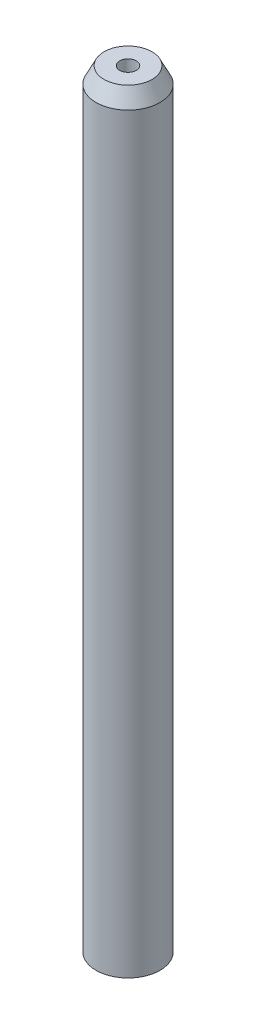
ISO-10303-21;
HEADER;
FILE_DESCRIPTION(('STEP AP214'),'2;1');
FILE_NAME('part.step','',(''),(''),'','','');
FILE_SCHEMA(('AUTOMOTIVE_DESIGN { 1 0 10303 214 1 1 1 1 }'));
ENDSEC;
DATA;
#1=APPLICATION_CONTEXT('core data for automotive mechanical design processes');
#2=APPLICATION_PROTOCOL_DEFINITION('international standard','automotive_design',2000,#1);
#3=PRODUCT_CONTEXT('',#1,'mechanical');
#4=PRODUCT('Part','Part','',(#3));
#5=PRODUCT_RELATED_PRODUCT_CATEGORY('part','',(#4));
#6=PRODUCT_DEFINITION_FORMATION('','',#4);
#7=PRODUCT_DEFINITION_CONTEXT('part definition',#1,'design');
#8=PRODUCT_DEFINITION('design','',#6,#7);
#9=PRODUCT_DEFINITION_SHAPE('','',#8);
#10=(LENGTH_UNIT() NAMED_UNIT(*) SI_UNIT(.MILLI.,.METRE.));
#11=(NAMED_UNIT(*) PLANE_ANGLE_UNIT() SI_UNIT($,.RADIAN.));
#12=(NAMED_UNIT(*) SI_UNIT($,.STERADIAN.) SOLID_ANGLE_UNIT());
#13=UNCERTAINTY_MEASURE_WITH_UNIT(LENGTH_MEASURE(1.E-05),#10,'distance_accuracy_value','');
#14=(GEOMETRIC_REPRESENTATION_CONTEXT(3) GLOBAL_UNCERTAINTY_ASSIGNED_CONTEXT((#13)) GLOBAL_UNIT_ASSIGNED_CONTEXT((#10,
#11,#12)) REPRESENTATION_CONTEXT('',''));
#15=CARTESIAN_POINT('',(0.,0.,0.));
#16=DIRECTION('',(0.,0.,1.));
#17=DIRECTION('',(1.,0.,0.));
#18=AXIS2_PLACEMENT_3D('',#15,#16,#17);
#19=CARTESIAN_POINT('',(0.,152.4,0.));
#20=DIRECTION('',(0.,-1.,0.));
#21=DIRECTION('',(0.,0.,-1.));
#22=AXIS2_PLACEMENT_3D('',#19,#20,#21);
#23=CYLINDRICAL_SURFACE('',#22,6.35);
#24=CARTESIAN_POINT('',(0.,0.,0.));
#25=DIRECTION('',(0.,1.,0.));
#26=DIRECTION('',(0.,0.,1.));
#27=AXIS2_PLACEMENT_3D('',#24,#25,#26);
#28=CIRCLE('',#27,6.35);
#29=CARTESIAN_POINT('',(0.,0.,6.35));
#30=VERTEX_POINT('',#29);
#31=EDGE_CURVE('E11',#30,#30,#28,.T.);
#32=ORIENTED_EDGE('',*,*,#31,.T.);
#33=EDGE_LOOP('',(#32));
#34=FACE_BOUND('',#33,.T.);
#35=CARTESIAN_POINT('',(0.,149.225,0.));
#36=DIRECTION('',(0.,1.,0.));
#37=DIRECTION('',(1.,0.,0.));
#38=AXIS2_PLACEMENT_3D('',#35,#36,#37);
#39=CIRCLE('',#38,6.35);
#40=CARTESIAN_POINT('',(6.35,149.225,0.));
#41=VERTEX_POINT('',#40);
#42=EDGE_CURVE('E83',#41,#41,#39,.T.);
#43=ORIENTED_EDGE('',*,*,#42,.F.);
#44=EDGE_LOOP('',(#43));
#45=FACE_BOUND('',#44,.T.);
#46=ADVANCED_FACE('F40',(#34,#45),#23,.T.);
#47=CARTESIAN_POINT('',(0.,0.,0.));
#48=DIRECTION('',(0.,1.,0.));
#49=DIRECTION('',(0.,0.,1.));
#50=AXIS2_PLACEMENT_3D('',#47,#48,#49);
#51=PLANE('',#50);
#52=CARTESIAN_POINT('',(0.,0.,0.));
#53=DIRECTION('',(0.,-1.,0.));
#54=DIRECTION('',(0.,0.,-1.));
#55=AXIS2_PLACEMENT_3D('',#52,#53,#54);
#56=CIRCLE('',#55,2.5);
#57=CARTESIAN_POINT('',(0.,0.,-2.5));
#58=VERTEX_POINT('',#57);
#59=EDGE_CURVE('E73',#58,#58,#56,.T.);
#60=ORIENTED_EDGE('',*,*,#59,.F.);
#61=EDGE_LOOP('',(#60));
#62=FACE_BOUND('',#61,.T.);
#63=ORIENTED_EDGE('',*,*,#31,.F.);
#64=EDGE_LOOP('',(#63));
#65=FACE_BOUND('',#64,.T.);
#66=ADVANCED_FACE('F90',(#62,#65),#51,.F.);
#67=CARTESIAN_POINT('',(0.,152.4,0.));
#68=DIRECTION('',(0.,-1.,0.));
#69=DIRECTION('',(0.,0.,-1.));
#70=AXIS2_PLACEMENT_3D('',#67,#68,#69);
#71=CONICAL_SURFACE('',#70,4.7625,0.463647609000805);
#72=DIRECTION('',(0.447213595499957,-0.894427190999917,0.));
#73=VECTOR('',#72,1.);
#74=CARTESIAN_POINT('',(6.35,149.225,0.));
#75=LINE('',#74,#73);
#76=CARTESIAN_POINT('',(4.7625,152.4,0.));
#77=VERTEX_POINT('',#76);
#78=EDGE_CURVE('E54',#77,#41,#75,.T.);
#79=ORIENTED_EDGE('',*,*,#78,.F.);
#80=CARTESIAN_POINT('',(0.,152.4,0.));
#81=DIRECTION('',(0.,1.,0.));
#82=DIRECTION('',(1.,0.,0.));
#83=AXIS2_PLACEMENT_3D('',#80,#81,#82);
#84=CIRCLE('',#83,4.7625);
#85=EDGE_CURVE('E47',#77,#77,#84,.T.);
#86=ORIENTED_EDGE('',*,*,#85,.F.);
#87=ORIENTED_EDGE('',*,*,#78,.T.);
#88=ORIENTED_EDGE('',*,*,#42,.T.);
#89=EDGE_LOOP('',(#79,#86,#87,#88));
#90=FACE_BOUND('',#89,.T.);
#91=ADVANCED_FACE('F88',(#90),#71,.T.);
#92=CARTESIAN_POINT('',(0.,152.4,0.));
#93=DIRECTION('',(0.,1.,0.));
#94=DIRECTION('',(0.,0.,1.));
#95=AXIS2_PLACEMENT_3D('',#92,#93,#94);
#96=PLANE('',#95);
#97=CARTESIAN_POINT('',(0.,152.4,0.));
#98=DIRECTION('',(0.,1.,0.));
#99=DIRECTION('',(0.,0.,1.));
#100=AXIS2_PLACEMENT_3D('',#97,#98,#99);
#101=CIRCLE('',#100,1.65);
#102=CARTESIAN_POINT('',(0.,152.4,1.65));
#103=VERTEX_POINT('',#102);
#104=EDGE_CURVE('E72',#103,#103,#101,.T.);
#105=ORIENTED_EDGE('',*,*,#104,.F.);
#106=EDGE_LOOP('',(#105));
#107=FACE_BOUND('',#106,.T.);
#108=ORIENTED_EDGE('',*,*,#85,.T.);
#109=EDGE_LOOP('',(#108));
#110=FACE_BOUND('',#109,.T.);
#111=ADVANCED_FACE('F87',(#107,#110),#96,.T.);
#112=CARTESIAN_POINT('',(0.,142.875,0.));
#113=DIRECTION('',(0.,1.,0.));
#114=DIRECTION('',(0.,0.,1.));
#115=AXIS2_PLACEMENT_3D('',#112,#113,#114);
#116=CONICAL_SURFACE('',#115,1.65,1.02974425867666);
#117=CARTESIAN_POINT('',(0.,141.883579978605,0.));
#118=VERTEX_POINT('',#117);
#119=VERTEX_LOOP('',#118);
#120=FACE_BOUND('',#119,.T.);
#121=CARTESIAN_POINT('',(0.,142.875,0.));
#122=DIRECTION('',(0.,1.,0.));
#123=DIRECTION('',(0.,0.,1.));
#124=AXIS2_PLACEMENT_3D('',#121,#122,#123);
#125=CIRCLE('',#124,1.65);
#126=CARTESIAN_POINT('',(0.,142.875,1.65));
#127=VERTEX_POINT('',#126);
#128=EDGE_CURVE('E76',#127,#127,#125,.T.);
#129=ORIENTED_EDGE('',*,*,#128,.T.);
#130=EDGE_LOOP('',(#129));
#131=FACE_BOUND('',#130,.T.);
#132=ADVANCED_FACE('F96',(#120,#131),#116,.F.);
#133=CARTESIAN_POINT('',(0.,152.4,0.));
#134=DIRECTION('',(0.,1.,0.));
#135=DIRECTION('',(0.,0.,1.));
#136=AXIS2_PLACEMENT_3D('',#133,#134,#135);
#137=CYLINDRICAL_SURFACE('',#136,1.65);
#138=ORIENTED_EDGE('',*,*,#128,.F.);
#139=EDGE_LOOP('',(#138));
#140=FACE_BOUND('',#139,.T.);
#141=ORIENTED_EDGE('',*,*,#104,.T.);
#142=EDGE_LOOP('',(#141));
#143=FACE_BOUND('',#142,.T.);
#144=ADVANCED_FACE('F66',(#140,#143),#137,.F.);
#145=CARTESIAN_POINT('',(0.,12.7,0.));
#146=DIRECTION('',(0.,-1.,0.));
#147=DIRECTION('',(0.,0.,-1.));
#148=AXIS2_PLACEMENT_3D('',#145,#146,#147);
#149=CONICAL_SURFACE('',#148,2.5,1.02974425867665);
#150=CARTESIAN_POINT('',(0.,14.2021515475689,0.));
#151=VERTEX_POINT('',#150);
#152=VERTEX_LOOP('',#151);
#153=FACE_BOUND('',#152,.T.);
#154=CARTESIAN_POINT('',(0.,12.7,0.));
#155=DIRECTION('',(0.,-1.,0.));
#156=DIRECTION('',(0.,0.,-1.));
#157=AXIS2_PLACEMENT_3D('',#154,#155,#156);
#158=CIRCLE('',#157,2.5);
#159=CARTESIAN_POINT('',(0.,12.7,-2.5));
#160=VERTEX_POINT('',#159);
#161=EDGE_CURVE('E70',#160,#160,#158,.T.);
#162=ORIENTED_EDGE('',*,*,#161,.T.);
#163=EDGE_LOOP('',(#162));
#164=FACE_BOUND('',#163,.T.);
#165=ADVANCED_FACE('F62',(#153,#164),#149,.F.);
#166=CARTESIAN_POINT('',(0.,0.,0.));
#167=DIRECTION('',(0.,-1.,0.));
#168=DIRECTION('',(0.,0.,-1.));
#169=AXIS2_PLACEMENT_3D('',#166,#167,#168);
#170=CYLINDRICAL_SURFACE('',#169,2.5);
#171=ORIENTED_EDGE('',*,*,#161,.F.);
#172=EDGE_LOOP('',(#171));
#173=FACE_BOUND('',#172,.T.);
#174=ORIENTED_EDGE('',*,*,#59,.T.);
#175=EDGE_LOOP('',(#174));
#176=FACE_BOUND('',#175,.T.);
#177=ADVANCED_FACE('F65',(#173,#176),#170,.F.);
#178=CLOSED_SHELL('',(#46,#66,#91,#111,#132,#144,#165,#177));
#179=MANIFOLD_SOLID_BREP('B2',#178);
#180=ADVANCED_BREP_SHAPE_REPRESENTATION('',(#18,#179),#14);
#181=SHAPE_DEFINITION_REPRESENTATION(#9,#180);
ENDSEC;
END-ISO-10303-21;
